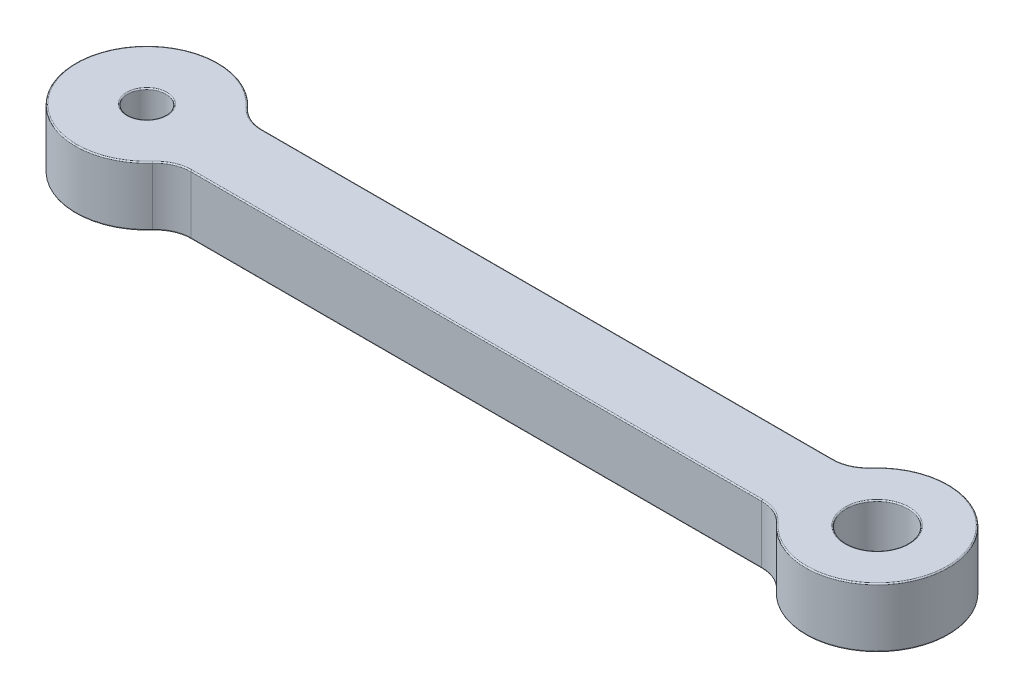
ISO-10303-21;
HEADER;
FILE_DESCRIPTION(('STEP AP214'),'2;1');
FILE_NAME('part.step','',(''),(''),'','','');
FILE_SCHEMA(('AUTOMOTIVE_DESIGN { 1 0 10303 214 1 1 1 1 }'));
ENDSEC;
DATA;
#1=APPLICATION_CONTEXT('core data for automotive mechanical design processes');
#2=APPLICATION_PROTOCOL_DEFINITION('international standard','automotive_design',2000,#1);
#3=PRODUCT_CONTEXT('',#1,'mechanical');
#4=PRODUCT('Part','Part','',(#3));
#5=PRODUCT_RELATED_PRODUCT_CATEGORY('part','',(#4));
#6=PRODUCT_DEFINITION_FORMATION('','',#4);
#7=PRODUCT_DEFINITION_CONTEXT('part definition',#1,'design');
#8=PRODUCT_DEFINITION('design','',#6,#7);
#9=PRODUCT_DEFINITION_SHAPE('','',#8);
#10=(LENGTH_UNIT() NAMED_UNIT(*) SI_UNIT(.MILLI.,.METRE.));
#11=(NAMED_UNIT(*) PLANE_ANGLE_UNIT() SI_UNIT($,.RADIAN.));
#12=(NAMED_UNIT(*) SI_UNIT($,.STERADIAN.) SOLID_ANGLE_UNIT());
#13=UNCERTAINTY_MEASURE_WITH_UNIT(LENGTH_MEASURE(1.E-05),#10,'distance_accuracy_value','');
#14=(GEOMETRIC_REPRESENTATION_CONTEXT(3) GLOBAL_UNCERTAINTY_ASSIGNED_CONTEXT((#13)) GLOBAL_UNIT_ASSIGNED_CONTEXT((#10,
#11,#12)) REPRESENTATION_CONTEXT('',''));
#15=CARTESIAN_POINT('',(0.,0.,0.));
#16=DIRECTION('',(0.,0.,1.));
#17=DIRECTION('',(1.,0.,0.));
#18=AXIS2_PLACEMENT_3D('',#15,#16,#17);
#19=CARTESIAN_POINT('',(0.,5.,-3.));
#20=DIRECTION('',(0.,0.,-1.));
#21=DIRECTION('',(-1.,0.,0.));
#22=AXIS2_PLACEMENT_3D('',#19,#20,#21);
#23=PLANE('',#22);
#24=DIRECTION('',(0.,-1.,0.));
#25=VECTOR('',#24,1.);
#26=CARTESIAN_POINT('',(54.7082039324994,5.,-3.));
#27=LINE('',#26,#25);
#28=CARTESIAN_POINT('',(54.7082039324994,4.9,-3.));
#29=VERTEX_POINT('',#28);
#30=CARTESIAN_POINT('',(54.7082039324994,0.1,-3.));
#31=VERTEX_POINT('',#30);
#32=EDGE_CURVE('E352',#29,#31,#27,.T.);
#33=ORIENTED_EDGE('',*,*,#32,.T.);
#34=DIRECTION('',(1.,0.,0.));
#35=VECTOR('',#34,1.);
#36=CARTESIAN_POINT('',(6.70820393249937,0.1,-3.));
#37=LINE('',#36,#35);
#38=CARTESIAN_POINT('',(6.70820393249937,0.1,-3.));
#39=VERTEX_POINT('',#38);
#40=EDGE_CURVE('E277',#31,#39,#37,.F.);
#41=ORIENTED_EDGE('',*,*,#40,.T.);
#42=DIRECTION('',(0.,-1.,0.));
#43=VECTOR('',#42,1.);
#44=CARTESIAN_POINT('',(6.70820393249937,5.,-3.));
#45=LINE('',#44,#43);
#46=CARTESIAN_POINT('',(6.70820393249937,4.9,-3.));
#47=VERTEX_POINT('',#46);
#48=EDGE_CURVE('E184',#47,#39,#45,.T.);
#49=ORIENTED_EDGE('',*,*,#48,.F.);
#50=DIRECTION('',(1.,0.,0.));
#51=VECTOR('',#50,1.);
#52=CARTESIAN_POINT('',(0.,4.9,-3.));
#53=LINE('',#52,#51);
#54=EDGE_CURVE('E274',#47,#29,#53,.T.);
#55=ORIENTED_EDGE('',*,*,#54,.T.);
#56=EDGE_LOOP('',(#33,#41,#49,#55));
#57=FACE_BOUND('',#56,.T.);
#58=ADVANCED_FACE('F45',(#57),#23,.T.);
#59=CARTESIAN_POINT('',(6.70820393249937,5.,-6.));
#60=DIRECTION('',(0.,-1.,0.));
#61=DIRECTION('',(0.,0.,-1.));
#62=AXIS2_PLACEMENT_3D('',#59,#60,#61);
#63=CYLINDRICAL_SURFACE('',#62,3.);
#64=ORIENTED_EDGE('',*,*,#48,.T.);
#65=CARTESIAN_POINT('',(6.70820393249937,0.1,-6.));
#66=DIRECTION('',(0.,1.,0.));
#67=DIRECTION('',(0.,0.,1.));
#68=AXIS2_PLACEMENT_3D('',#65,#66,#67);
#69=CIRCLE('',#68,3.);
#70=CARTESIAN_POINT('',(4.47213595499958,0.1,-4.));
#71=VERTEX_POINT('',#70);
#72=EDGE_CURVE('E182',#39,#71,#69,.F.);
#73=ORIENTED_EDGE('',*,*,#72,.T.);
#74=DIRECTION('',(0.,-1.,0.));
#75=VECTOR('',#74,1.);
#76=CARTESIAN_POINT('',(4.47213595499958,5.,-4.));
#77=LINE('',#76,#75);
#78=CARTESIAN_POINT('',(4.47213595499958,4.9,-4.));
#79=VERTEX_POINT('',#78);
#80=EDGE_CURVE('E163',#79,#71,#77,.T.);
#81=ORIENTED_EDGE('',*,*,#80,.F.);
#82=CARTESIAN_POINT('',(6.70820393249937,4.9,-6.));
#83=DIRECTION('',(0.,1.,0.));
#84=DIRECTION('',(0.,0.,1.));
#85=AXIS2_PLACEMENT_3D('',#82,#83,#84);
#86=CIRCLE('',#85,3.);
#87=EDGE_CURVE('E179',#79,#47,#86,.T.);
#88=ORIENTED_EDGE('',*,*,#87,.T.);
#89=EDGE_LOOP('',(#64,#73,#81,#88));
#90=FACE_BOUND('',#89,.T.);
#91=ADVANCED_FACE('F177',(#90),#63,.F.);
#92=CARTESIAN_POINT('',(0.,5.,0.));
#93=DIRECTION('',(0.,-1.,0.));
#94=DIRECTION('',(0.,0.,-1.));
#95=AXIS2_PLACEMENT_3D('',#92,#93,#94);
#96=CYLINDRICAL_SURFACE('',#95,6.);
#97=ORIENTED_EDGE('',*,*,#80,.T.);
#98=CARTESIAN_POINT('',(0.,0.1,0.));
#99=DIRECTION('',(0.,1.,0.));
#100=DIRECTION('',(0.,0.,1.));
#101=AXIS2_PLACEMENT_3D('',#98,#99,#100);
#102=CIRCLE('',#101,6.);
#103=CARTESIAN_POINT('',(4.47213595499958,0.1,4.));
#104=VERTEX_POINT('',#103);
#105=EDGE_CURVE('E171',#71,#104,#102,.T.);
#106=ORIENTED_EDGE('',*,*,#105,.T.);
#107=DIRECTION('',(0.,-1.,0.));
#108=VECTOR('',#107,1.);
#109=CARTESIAN_POINT('',(4.47213595499958,5.,4.));
#110=LINE('',#109,#108);
#111=CARTESIAN_POINT('',(4.47213595499958,4.9,4.));
#112=VERTEX_POINT('',#111);
#113=EDGE_CURVE('E165',#112,#104,#110,.T.);
#114=ORIENTED_EDGE('',*,*,#113,.F.);
#115=CARTESIAN_POINT('',(0.,4.9,0.));
#116=DIRECTION('',(0.,1.,0.));
#117=DIRECTION('',(0.,0.,1.));
#118=AXIS2_PLACEMENT_3D('',#115,#116,#117);
#119=CIRCLE('',#118,6.);
#120=EDGE_CURVE('E160',#112,#79,#119,.F.);
#121=ORIENTED_EDGE('',*,*,#120,.T.);
#122=EDGE_LOOP('',(#97,#106,#114,#121));
#123=FACE_BOUND('',#122,.T.);
#124=ADVANCED_FACE('F162',(#123),#96,.T.);
#125=CARTESIAN_POINT('',(6.70820393249937,5.,6.));
#126=DIRECTION('',(0.,-1.,0.));
#127=DIRECTION('',(0.,0.,-1.));
#128=AXIS2_PLACEMENT_3D('',#125,#126,#127);
#129=CYLINDRICAL_SURFACE('',#128,3.);
#130=ORIENTED_EDGE('',*,*,#113,.T.);
#131=CARTESIAN_POINT('',(6.70820393249937,0.1,6.));
#132=DIRECTION('',(0.,1.,0.));
#133=DIRECTION('',(0.,0.,1.));
#134=AXIS2_PLACEMENT_3D('',#131,#132,#133);
#135=CIRCLE('',#134,3.);
#136=CARTESIAN_POINT('',(6.70820393249937,0.1,3.));
#137=VERTEX_POINT('',#136);
#138=EDGE_CURVE('E246',#104,#137,#135,.F.);
#139=ORIENTED_EDGE('',*,*,#138,.T.);
#140=DIRECTION('',(0.,-1.,0.));
#141=VECTOR('',#140,1.);
#142=CARTESIAN_POINT('',(6.70820393249937,5.,3.));
#143=LINE('',#142,#141);
#144=CARTESIAN_POINT('',(6.70820393249937,4.9,3.));
#145=VERTEX_POINT('',#144);
#146=EDGE_CURVE('E409',#145,#137,#143,.T.);
#147=ORIENTED_EDGE('',*,*,#146,.F.);
#148=CARTESIAN_POINT('',(6.70820393249937,4.9,6.));
#149=DIRECTION('',(0.,1.,0.));
#150=DIRECTION('',(0.,0.,1.));
#151=AXIS2_PLACEMENT_3D('',#148,#149,#150);
#152=CIRCLE('',#151,3.);
#153=EDGE_CURVE('E243',#145,#112,#152,.T.);
#154=ORIENTED_EDGE('',*,*,#153,.T.);
#155=EDGE_LOOP('',(#130,#139,#147,#154));
#156=FACE_BOUND('',#155,.T.);
#157=ADVANCED_FACE('F416',(#156),#129,.F.);
#158=CARTESIAN_POINT('',(0.,5.,3.));
#159=DIRECTION('',(0.,0.,-1.));
#160=DIRECTION('',(-1.,0.,0.));
#161=AXIS2_PLACEMENT_3D('',#158,#159,#160);
#162=PLANE('',#161);
#163=ORIENTED_EDGE('',*,*,#146,.T.);
#164=DIRECTION('',(1.,0.,0.));
#165=VECTOR('',#164,1.);
#166=CARTESIAN_POINT('',(0.,0.1,3.));
#167=LINE('',#166,#165);
#168=CARTESIAN_POINT('',(54.7082039324994,0.1,3.));
#169=VERTEX_POINT('',#168);
#170=EDGE_CURVE('E252',#137,#169,#167,.T.);
#171=ORIENTED_EDGE('',*,*,#170,.T.);
#172=DIRECTION('',(0.,-1.,0.));
#173=VECTOR('',#172,1.);
#174=CARTESIAN_POINT('',(54.7082039324994,5.,3.));
#175=LINE('',#174,#173);
#176=CARTESIAN_POINT('',(54.7082039324994,4.9,3.));
#177=VERTEX_POINT('',#176);
#178=EDGE_CURVE('E405',#177,#169,#175,.T.);
#179=ORIENTED_EDGE('',*,*,#178,.F.);
#180=DIRECTION('',(1.,0.,0.));
#181=VECTOR('',#180,1.);
#182=CARTESIAN_POINT('',(6.70820393249937,4.9,3.));
#183=LINE('',#182,#181);
#184=EDGE_CURVE('E249',#177,#145,#183,.F.);
#185=ORIENTED_EDGE('',*,*,#184,.T.);
#186=EDGE_LOOP('',(#163,#171,#179,#185));
#187=FACE_BOUND('',#186,.T.);
#188=ADVANCED_FACE('F459',(#187),#162,.F.);
#189=CARTESIAN_POINT('',(54.7082039324994,5.,6.));
#190=DIRECTION('',(0.,-1.,0.));
#191=DIRECTION('',(0.,0.,-1.));
#192=AXIS2_PLACEMENT_3D('',#189,#190,#191);
#193=CYLINDRICAL_SURFACE('',#192,3.);
#194=ORIENTED_EDGE('',*,*,#178,.T.);
#195=CARTESIAN_POINT('',(54.7082039324994,0.1,6.));
#196=DIRECTION('',(0.,1.,0.));
#197=DIRECTION('',(0.,0.,1.));
#198=AXIS2_PLACEMENT_3D('',#195,#196,#197);
#199=CIRCLE('',#198,3.);
#200=CARTESIAN_POINT('',(56.9442719099992,0.1,4.));
#201=VERTEX_POINT('',#200);
#202=EDGE_CURVE('E258',#169,#201,#199,.F.);
#203=ORIENTED_EDGE('',*,*,#202,.T.);
#204=DIRECTION('',(0.,-1.,0.));
#205=VECTOR('',#204,1.);
#206=CARTESIAN_POINT('',(56.9442719099992,5.,4.));
#207=LINE('',#206,#205);
#208=CARTESIAN_POINT('',(56.9442719099992,4.9,4.));
#209=VERTEX_POINT('',#208);
#210=EDGE_CURVE('E399',#209,#201,#207,.T.);
#211=ORIENTED_EDGE('',*,*,#210,.F.);
#212=CARTESIAN_POINT('',(54.7082039324994,4.9,6.));
#213=DIRECTION('',(0.,1.,0.));
#214=DIRECTION('',(0.,0.,1.));
#215=AXIS2_PLACEMENT_3D('',#212,#213,#214);
#216=CIRCLE('',#215,3.);
#217=EDGE_CURVE('E255',#209,#177,#216,.T.);
#218=ORIENTED_EDGE('',*,*,#217,.T.);
#219=EDGE_LOOP('',(#194,#203,#211,#218));
#220=FACE_BOUND('',#219,.T.);
#221=ADVANCED_FACE('F461',(#220),#193,.F.);
#222=CARTESIAN_POINT('',(61.4164078649987,5.,0.));
#223=DIRECTION('',(0.,-1.,0.));
#224=DIRECTION('',(0.,0.,-1.));
#225=AXIS2_PLACEMENT_3D('',#222,#223,#224);
#226=CYLINDRICAL_SURFACE('',#225,6.);
#227=ORIENTED_EDGE('',*,*,#210,.T.);
#228=CARTESIAN_POINT('',(61.4164078649987,0.1,0.));
#229=DIRECTION('',(0.,1.,0.));
#230=DIRECTION('',(0.,0.,1.));
#231=AXIS2_PLACEMENT_3D('',#228,#229,#230);
#232=CIRCLE('',#231,6.);
#233=CARTESIAN_POINT('',(56.9442719099992,0.1,-4.));
#234=VERTEX_POINT('',#233);
#235=EDGE_CURVE('E264',#201,#234,#232,.T.);
#236=ORIENTED_EDGE('',*,*,#235,.T.);
#237=DIRECTION('',(0.,-1.,0.));
#238=VECTOR('',#237,1.);
#239=CARTESIAN_POINT('',(56.9442719099992,5.,-4.));
#240=LINE('',#239,#238);
#241=CARTESIAN_POINT('',(56.9442719099992,4.9,-4.));
#242=VERTEX_POINT('',#241);
#243=EDGE_CURVE('E396',#242,#234,#240,.T.);
#244=ORIENTED_EDGE('',*,*,#243,.F.);
#245=CARTESIAN_POINT('',(61.4164078649987,4.9,0.));
#246=DIRECTION('',(0.,1.,0.));
#247=DIRECTION('',(0.,0.,1.));
#248=AXIS2_PLACEMENT_3D('',#245,#246,#247);
#249=CIRCLE('',#248,6.);
#250=EDGE_CURVE('E261',#242,#209,#249,.F.);
#251=ORIENTED_EDGE('',*,*,#250,.T.);
#252=EDGE_LOOP('',(#227,#236,#244,#251));
#253=FACE_BOUND('',#252,.T.);
#254=ADVANCED_FACE('F494',(#253),#226,.T.);
#255=CARTESIAN_POINT('',(61.4164078649987,5.,0.));
#256=DIRECTION('',(0.,-1.,0.));
#257=DIRECTION('',(0.,0.,-1.));
#258=AXIS2_PLACEMENT_3D('',#255,#256,#257);
#259=CYLINDRICAL_SURFACE('',#258,2.6);
#260=CARTESIAN_POINT('',(61.4164078649987,0.1,0.));
#261=DIRECTION('',(0.,1.,0.));
#262=DIRECTION('',(0.,0.,1.));
#263=AXIS2_PLACEMENT_3D('',#260,#261,#262);
#264=CIRCLE('',#263,2.6);
#265=CARTESIAN_POINT('',(61.4164078649987,0.1,2.6));
#266=VERTEX_POINT('',#265);
#267=EDGE_CURVE('E284',#266,#266,#264,.F.);
#268=ORIENTED_EDGE('',*,*,#267,.T.);
#269=EDGE_LOOP('',(#268));
#270=FACE_BOUND('',#269,.T.);
#271=CARTESIAN_POINT('',(61.4164078649987,4.9,0.));
#272=DIRECTION('',(0.,1.,0.));
#273=DIRECTION('',(0.,0.,1.));
#274=AXIS2_PLACEMENT_3D('',#271,#272,#273);
#275=CIRCLE('',#274,2.6);
#276=CARTESIAN_POINT('',(61.4164078649987,4.9,2.6));
#277=VERTEX_POINT('',#276);
#278=EDGE_CURVE('E280',#277,#277,#275,.T.);
#279=ORIENTED_EDGE('',*,*,#278,.T.);
#280=EDGE_LOOP('',(#279));
#281=FACE_BOUND('',#280,.T.);
#282=ADVANCED_FACE('F490',(#270,#281),#259,.F.);
#283=CARTESIAN_POINT('',(0.,5.,0.));
#284=DIRECTION('',(0.,-1.,0.));
#285=DIRECTION('',(0.,0.,-1.));
#286=AXIS2_PLACEMENT_3D('',#283,#284,#285);
#287=CYLINDRICAL_SURFACE('',#286,1.6);
#288=CARTESIAN_POINT('',(0.,0.1,0.));
#289=DIRECTION('',(0.,1.,0.));
#290=DIRECTION('',(0.,0.,1.));
#291=AXIS2_PLACEMENT_3D('',#288,#289,#290);
#292=CIRCLE('',#291,1.6);
#293=CARTESIAN_POINT('',(0.,0.1,1.6));
#294=VERTEX_POINT('',#293);
#295=EDGE_CURVE('E292',#294,#294,#292,.F.);
#296=ORIENTED_EDGE('',*,*,#295,.T.);
#297=EDGE_LOOP('',(#296));
#298=FACE_BOUND('',#297,.T.);
#299=CARTESIAN_POINT('',(0.,4.9,0.));
#300=DIRECTION('',(0.,1.,0.));
#301=DIRECTION('',(0.,0.,1.));
#302=AXIS2_PLACEMENT_3D('',#299,#300,#301);
#303=CIRCLE('',#302,1.6);
#304=CARTESIAN_POINT('',(0.,4.9,1.6));
#305=VERTEX_POINT('',#304);
#306=EDGE_CURVE('E288',#305,#305,#303,.T.);
#307=ORIENTED_EDGE('',*,*,#306,.T.);
#308=EDGE_LOOP('',(#307));
#309=FACE_BOUND('',#308,.T.);
#310=ADVANCED_FACE('F493',(#298,#309),#287,.F.);
#311=CARTESIAN_POINT('',(54.7082039324994,5.,-6.));
#312=DIRECTION('',(0.,-1.,0.));
#313=DIRECTION('',(0.,0.,-1.));
#314=AXIS2_PLACEMENT_3D('',#311,#312,#313);
#315=CYLINDRICAL_SURFACE('',#314,3.);
#316=ORIENTED_EDGE('',*,*,#243,.T.);
#317=CARTESIAN_POINT('',(54.7082039324994,0.1,-6.));
#318=DIRECTION('',(0.,1.,0.));
#319=DIRECTION('',(0.,0.,1.));
#320=AXIS2_PLACEMENT_3D('',#317,#318,#319);
#321=CIRCLE('',#320,3.);
#322=EDGE_CURVE('E271',#234,#31,#321,.F.);
#323=ORIENTED_EDGE('',*,*,#322,.T.);
#324=ORIENTED_EDGE('',*,*,#32,.F.);
#325=CARTESIAN_POINT('',(54.7082039324994,4.9,-6.));
#326=DIRECTION('',(0.,1.,0.));
#327=DIRECTION('',(0.,0.,1.));
#328=AXIS2_PLACEMENT_3D('',#325,#326,#327);
#329=CIRCLE('',#328,3.);
#330=EDGE_CURVE('E267',#29,#242,#329,.T.);
#331=ORIENTED_EDGE('',*,*,#330,.T.);
#332=EDGE_LOOP('',(#316,#323,#324,#331));
#333=FACE_BOUND('',#332,.T.);
#334=ADVANCED_FACE('F392',(#333),#315,.F.);
#335=CARTESIAN_POINT('',(0.,5.,0.));
#336=DIRECTION('',(0.,1.,0.));
#337=DIRECTION('',(0.,0.,1.));
#338=AXIS2_PLACEMENT_3D('',#335,#336,#337);
#339=PLANE('',#338);
#340=CARTESIAN_POINT('',(61.4164078649987,5.,0.));
#341=DIRECTION('',(0.,1.,0.));
#342=DIRECTION('',(0.,0.,1.));
#343=AXIS2_PLACEMENT_3D('',#340,#341,#342);
#344=CIRCLE('',#343,5.9);
#345=CARTESIAN_POINT('',(57.0188075092492,5.,3.93333333333333));
#346=VERTEX_POINT('',#345);
#347=CARTESIAN_POINT('',(57.0188075092492,5.,-3.93333333333333));
#348=VERTEX_POINT('',#347);
#349=EDGE_CURVE('E55',#346,#348,#344,.T.);
#350=ORIENTED_EDGE('',*,*,#349,.T.);
#351=CARTESIAN_POINT('',(54.7082039324994,5.,-6.));
#352=DIRECTION('',(0.,1.,0.));
#353=DIRECTION('',(0.,0.,1.));
#354=AXIS2_PLACEMENT_3D('',#351,#352,#353);
#355=CIRCLE('',#354,3.1);
#356=CARTESIAN_POINT('',(54.7082039324994,5.,-2.9));
#357=VERTEX_POINT('',#356);
#358=EDGE_CURVE('E11',#348,#357,#355,.F.);
#359=ORIENTED_EDGE('',*,*,#358,.T.);
#360=DIRECTION('',(1.,0.,0.));
#361=VECTOR('',#360,1.);
#362=CARTESIAN_POINT('',(0.,5.,-2.9));
#363=LINE('',#362,#361);
#364=CARTESIAN_POINT('',(6.70820393249937,5.,-2.9));
#365=VERTEX_POINT('',#364);
#366=EDGE_CURVE('E304',#357,#365,#363,.F.);
#367=ORIENTED_EDGE('',*,*,#366,.T.);
#368=CARTESIAN_POINT('',(6.70820393249937,5.,-6.));
#369=DIRECTION('',(0.,1.,0.));
#370=DIRECTION('',(0.,0.,1.));
#371=AXIS2_PLACEMENT_3D('',#368,#369,#370);
#372=CIRCLE('',#371,3.1);
#373=CARTESIAN_POINT('',(4.39760035574959,5.,-3.93333333333333));
#374=VERTEX_POINT('',#373);
#375=EDGE_CURVE('E307',#365,#374,#372,.F.);
#376=ORIENTED_EDGE('',*,*,#375,.T.);
#377=CARTESIAN_POINT('',(0.,5.,0.));
#378=DIRECTION('',(0.,1.,0.));
#379=DIRECTION('',(0.,0.,1.));
#380=AXIS2_PLACEMENT_3D('',#377,#378,#379);
#381=CIRCLE('',#380,5.9);
#382=CARTESIAN_POINT('',(4.39760035574958,5.,3.93333333333333));
#383=VERTEX_POINT('',#382);
#384=EDGE_CURVE('E190',#374,#383,#381,.T.);
#385=ORIENTED_EDGE('',*,*,#384,.T.);
#386=CARTESIAN_POINT('',(6.70820393249937,5.,6.));
#387=DIRECTION('',(0.,1.,0.));
#388=DIRECTION('',(0.,0.,1.));
#389=AXIS2_PLACEMENT_3D('',#386,#387,#388);
#390=CIRCLE('',#389,3.1);
#391=CARTESIAN_POINT('',(6.70820393249937,5.,2.9));
#392=VERTEX_POINT('',#391);
#393=EDGE_CURVE('E312',#383,#392,#390,.F.);
#394=ORIENTED_EDGE('',*,*,#393,.T.);
#395=DIRECTION('',(1.,0.,0.));
#396=VECTOR('',#395,1.);
#397=CARTESIAN_POINT('',(54.7082039324994,5.,2.9));
#398=LINE('',#397,#396);
#399=CARTESIAN_POINT('',(54.7082039324994,5.,2.9));
#400=VERTEX_POINT('',#399);
#401=EDGE_CURVE('E315',#392,#400,#398,.T.);
#402=ORIENTED_EDGE('',*,*,#401,.T.);
#403=CARTESIAN_POINT('',(54.7082039324994,5.,6.));
#404=DIRECTION('',(0.,1.,0.));
#405=DIRECTION('',(0.,0.,1.));
#406=AXIS2_PLACEMENT_3D('',#403,#404,#405);
#407=CIRCLE('',#406,3.1);
#408=EDGE_CURVE('E66',#400,#346,#407,.F.);
#409=ORIENTED_EDGE('',*,*,#408,.T.);
#410=EDGE_LOOP('',(#350,#359,#367,#376,#385,#394,#402,#409));
#411=FACE_BOUND('',#410,.T.);
#412=CARTESIAN_POINT('',(61.4164078649987,5.,0.));
#413=DIRECTION('',(0.,1.,0.));
#414=DIRECTION('',(0.,0.,1.));
#415=AXIS2_PLACEMENT_3D('',#412,#413,#414);
#416=CIRCLE('',#415,2.7);
#417=CARTESIAN_POINT('',(61.4164078649987,5.,2.7));
#418=VERTEX_POINT('',#417);
#419=EDGE_CURVE('E300',#418,#418,#416,.F.);
#420=ORIENTED_EDGE('',*,*,#419,.T.);
#421=EDGE_LOOP('',(#420));
#422=FACE_BOUND('',#421,.T.);
#423=CARTESIAN_POINT('',(0.,5.,0.));
#424=DIRECTION('',(0.,1.,0.));
#425=DIRECTION('',(0.,0.,1.));
#426=AXIS2_PLACEMENT_3D('',#423,#424,#425);
#427=CIRCLE('',#426,1.7);
#428=CARTESIAN_POINT('',(0.,5.,1.7));
#429=VERTEX_POINT('',#428);
#430=EDGE_CURVE('E296',#429,#429,#427,.F.);
#431=ORIENTED_EDGE('',*,*,#430,.T.);
#432=EDGE_LOOP('',(#431));
#433=FACE_BOUND('',#432,.T.);
#434=ADVANCED_FACE('F378',(#411,#422,#433),#339,.T.);
#435=CARTESIAN_POINT('',(0.,0.,0.));
#436=DIRECTION('',(0.,1.,0.));
#437=DIRECTION('',(0.,0.,1.));
#438=AXIS2_PLACEMENT_3D('',#435,#436,#437);
#439=PLANE('',#438);
#440=CARTESIAN_POINT('',(0.,0.,0.));
#441=DIRECTION('',(0.,1.,0.));
#442=DIRECTION('',(0.,0.,1.));
#443=AXIS2_PLACEMENT_3D('',#440,#441,#442);
#444=CIRCLE('',#443,5.9);
#445=CARTESIAN_POINT('',(4.39760035574959,0.,3.93333333333333));
#446=VERTEX_POINT('',#445);
#447=CARTESIAN_POINT('',(4.39760035574959,0.,-3.93333333333333));
#448=VERTEX_POINT('',#447);
#449=EDGE_CURVE('E235',#446,#448,#444,.F.);
#450=ORIENTED_EDGE('',*,*,#449,.T.);
#451=CARTESIAN_POINT('',(6.70820393249937,0.,-6.));
#452=DIRECTION('',(0.,1.,0.));
#453=DIRECTION('',(0.,0.,1.));
#454=AXIS2_PLACEMENT_3D('',#451,#452,#453);
#455=CIRCLE('',#454,3.1);
#456=CARTESIAN_POINT('',(6.70820393249937,0.,-2.9));
#457=VERTEX_POINT('',#456);
#458=EDGE_CURVE('E172',#448,#457,#455,.T.);
#459=ORIENTED_EDGE('',*,*,#458,.T.);
#460=DIRECTION('',(1.,0.,0.));
#461=VECTOR('',#460,1.);
#462=CARTESIAN_POINT('',(54.7082039324994,0.,-2.9));
#463=LINE('',#462,#461);
#464=CARTESIAN_POINT('',(54.7082039324994,0.,-2.9));
#465=VERTEX_POINT('',#464);
#466=EDGE_CURVE('E217',#457,#465,#463,.T.);
#467=ORIENTED_EDGE('',*,*,#466,.T.);
#468=CARTESIAN_POINT('',(54.7082039324994,0.,-6.));
#469=DIRECTION('',(0.,1.,0.));
#470=DIRECTION('',(0.,0.,1.));
#471=AXIS2_PLACEMENT_3D('',#468,#469,#470);
#472=CIRCLE('',#471,3.1);
#473=CARTESIAN_POINT('',(57.0188075092492,0.,-3.93333333333333));
#474=VERTEX_POINT('',#473);
#475=EDGE_CURVE('E220',#465,#474,#472,.T.);
#476=ORIENTED_EDGE('',*,*,#475,.T.);
#477=CARTESIAN_POINT('',(61.4164078649987,0.,0.));
#478=DIRECTION('',(0.,1.,0.));
#479=DIRECTION('',(0.,0.,1.));
#480=AXIS2_PLACEMENT_3D('',#477,#478,#479);
#481=CIRCLE('',#480,5.9);
#482=CARTESIAN_POINT('',(57.0188075092492,0.,3.93333333333333));
#483=VERTEX_POINT('',#482);
#484=EDGE_CURVE('E223',#474,#483,#481,.F.);
#485=ORIENTED_EDGE('',*,*,#484,.T.);
#486=CARTESIAN_POINT('',(54.7082039324994,0.,6.));
#487=DIRECTION('',(0.,1.,0.));
#488=DIRECTION('',(0.,0.,1.));
#489=AXIS2_PLACEMENT_3D('',#486,#487,#488);
#490=CIRCLE('',#489,3.1);
#491=CARTESIAN_POINT('',(54.7082039324994,0.,2.9));
#492=VERTEX_POINT('',#491);
#493=EDGE_CURVE('E226',#483,#492,#490,.T.);
#494=ORIENTED_EDGE('',*,*,#493,.T.);
#495=DIRECTION('',(1.,0.,0.));
#496=VECTOR('',#495,1.);
#497=CARTESIAN_POINT('',(0.,0.,2.9));
#498=LINE('',#497,#496);
#499=CARTESIAN_POINT('',(6.70820393249937,0.,2.9));
#500=VERTEX_POINT('',#499);
#501=EDGE_CURVE('E229',#492,#500,#498,.F.);
#502=ORIENTED_EDGE('',*,*,#501,.T.);
#503=CARTESIAN_POINT('',(6.70820393249937,0.,6.));
#504=DIRECTION('',(0.,1.,0.));
#505=DIRECTION('',(0.,0.,1.));
#506=AXIS2_PLACEMENT_3D('',#503,#504,#505);
#507=CIRCLE('',#506,3.1);
#508=EDGE_CURVE('E232',#500,#446,#507,.T.);
#509=ORIENTED_EDGE('',*,*,#508,.T.);
#510=EDGE_LOOP('',(#450,#459,#467,#476,#485,#494,#502,#509));
#511=FACE_BOUND('',#510,.T.);
#512=CARTESIAN_POINT('',(61.4164078649987,0.,0.));
#513=DIRECTION('',(0.,1.,0.));
#514=DIRECTION('',(0.,0.,1.));
#515=AXIS2_PLACEMENT_3D('',#512,#513,#514);
#516=CIRCLE('',#515,2.7);
#517=CARTESIAN_POINT('',(61.4164078649987,0.,2.7));
#518=VERTEX_POINT('',#517);
#519=EDGE_CURVE('E213',#518,#518,#516,.T.);
#520=ORIENTED_EDGE('',*,*,#519,.T.);
#521=EDGE_LOOP('',(#520));
#522=FACE_BOUND('',#521,.T.);
#523=CARTESIAN_POINT('',(0.,0.,0.));
#524=DIRECTION('',(0.,1.,0.));
#525=DIRECTION('',(0.,0.,1.));
#526=AXIS2_PLACEMENT_3D('',#523,#524,#525);
#527=CIRCLE('',#526,1.7);
#528=CARTESIAN_POINT('',(0.,0.,1.7));
#529=VERTEX_POINT('',#528);
#530=EDGE_CURVE('E206',#529,#529,#527,.T.);
#531=ORIENTED_EDGE('',*,*,#530,.T.);
#532=EDGE_LOOP('',(#531));
#533=FACE_BOUND('',#532,.T.);
#534=ADVANCED_FACE('F430',(#511,#522,#533),#439,.F.);
#535=CARTESIAN_POINT('',(54.7082039324994,0.1,6.));
#536=DIRECTION('',(0.,1.,0.));
#537=DIRECTION('',(0.,0.,1.));
#538=AXIS2_PLACEMENT_3D('',#535,#536,#537);
#539=TOROIDAL_SURFACE('',#538,3.1,0.1);
#540=CARTESIAN_POINT('',(54.7082039324994,0.1,2.9));
#541=DIRECTION('',(-1.,0.,0.));
#542=DIRECTION('',(0.,0.,1.));
#543=AXIS2_PLACEMENT_3D('',#540,#541,#542);
#544=CIRCLE('',#543,0.1);
#545=EDGE_CURVE('E344',#492,#169,#544,.T.);
#546=ORIENTED_EDGE('',*,*,#545,.F.);
#547=ORIENTED_EDGE('',*,*,#493,.F.);
#548=CARTESIAN_POINT('',(57.0188075092492,0.1,3.93333333333333));
#549=DIRECTION('',(0.666666666666677,0.,0.745355992499921));
#550=DIRECTION('',(0.745355992499921,0.,-0.666666666666677));
#551=AXIS2_PLACEMENT_3D('',#548,#549,#550);
#552=CIRCLE('',#551,0.1);
#553=EDGE_CURVE('E348',#201,#483,#552,.T.);
#554=ORIENTED_EDGE('',*,*,#553,.F.);
#555=ORIENTED_EDGE('',*,*,#202,.F.);
#556=EDGE_LOOP('',(#546,#547,#554,#555));
#557=FACE_BOUND('',#556,.T.);
#558=ADVANCED_FACE('F451',(#557),#539,.T.);
#559=CARTESIAN_POINT('',(61.4164078649987,0.1,0.));
#560=DIRECTION('',(0.,1.,0.));
#561=DIRECTION('',(0.,0.,1.));
#562=AXIS2_PLACEMENT_3D('',#559,#560,#561);
#563=TOROIDAL_SURFACE('',#562,5.9,0.1);
#564=ORIENTED_EDGE('',*,*,#553,.T.);
#565=ORIENTED_EDGE('',*,*,#484,.F.);
#566=CARTESIAN_POINT('',(57.0188075092492,0.1,-3.93333333333333));
#567=DIRECTION('',(-0.666666666666677,0.,0.745355992499921));
#568=DIRECTION('',(0.745355992499921,0.,0.666666666666677));
#569=AXIS2_PLACEMENT_3D('',#566,#567,#568);
#570=CIRCLE('',#569,0.1);
#571=EDGE_CURVE('E340',#234,#474,#570,.T.);
#572=ORIENTED_EDGE('',*,*,#571,.F.);
#573=ORIENTED_EDGE('',*,*,#235,.F.);
#574=EDGE_LOOP('',(#564,#565,#572,#573));
#575=FACE_BOUND('',#574,.T.);
#576=ADVANCED_FACE('F446',(#575),#563,.T.);
#577=CARTESIAN_POINT('',(0.,0.1,2.9));
#578=DIRECTION('',(1.,0.,0.));
#579=DIRECTION('',(0.,0.,-1.));
#580=AXIS2_PLACEMENT_3D('',#577,#578,#579);
#581=CYLINDRICAL_SURFACE('',#580,0.1);
#582=ORIENTED_EDGE('',*,*,#545,.T.);
#583=ORIENTED_EDGE('',*,*,#170,.F.);
#584=CARTESIAN_POINT('',(6.70820393249937,0.1,2.9));
#585=DIRECTION('',(-1.,0.,0.));
#586=DIRECTION('',(0.,0.,1.));
#587=AXIS2_PLACEMENT_3D('',#584,#585,#586);
#588=CIRCLE('',#587,0.1);
#589=EDGE_CURVE('E336',#500,#137,#588,.T.);
#590=ORIENTED_EDGE('',*,*,#589,.F.);
#591=ORIENTED_EDGE('',*,*,#501,.F.);
#592=EDGE_LOOP('',(#582,#583,#590,#591));
#593=FACE_BOUND('',#592,.T.);
#594=ADVANCED_FACE('F456',(#593),#581,.T.);
#595=CARTESIAN_POINT('',(54.7082039324994,0.1,-6.));
#596=DIRECTION('',(0.,1.,0.));
#597=DIRECTION('',(0.,0.,1.));
#598=AXIS2_PLACEMENT_3D('',#595,#596,#597);
#599=TOROIDAL_SURFACE('',#598,3.1,0.1);
#600=ORIENTED_EDGE('',*,*,#571,.T.);
#601=ORIENTED_EDGE('',*,*,#475,.F.);
#602=CARTESIAN_POINT('',(54.7082039324994,0.1,-2.9));
#603=DIRECTION('',(-1.,0.,0.));
#604=DIRECTION('',(0.,0.,1.));
#605=AXIS2_PLACEMENT_3D('',#602,#603,#604);
#606=CIRCLE('',#605,0.1);
#607=EDGE_CURVE('E332',#31,#465,#606,.T.);
#608=ORIENTED_EDGE('',*,*,#607,.F.);
#609=ORIENTED_EDGE('',*,*,#322,.F.);
#610=EDGE_LOOP('',(#600,#601,#608,#609));
#611=FACE_BOUND('',#610,.T.);
#612=ADVANCED_FACE('F442',(#611),#599,.T.);
#613=CARTESIAN_POINT('',(6.70820393249937,0.1,6.));
#614=DIRECTION('',(0.,1.,0.));
#615=DIRECTION('',(0.,0.,1.));
#616=AXIS2_PLACEMENT_3D('',#613,#614,#615);
#617=TOROIDAL_SURFACE('',#616,3.1,0.1);
#618=ORIENTED_EDGE('',*,*,#589,.T.);
#619=ORIENTED_EDGE('',*,*,#138,.F.);
#620=CARTESIAN_POINT('',(4.39760035574959,0.1,3.93333333333333));
#621=DIRECTION('',(-0.666666666666669,0.,0.745355992499928));
#622=DIRECTION('',(0.745355992499928,0.,0.666666666666669));
#623=AXIS2_PLACEMENT_3D('',#620,#621,#622);
#624=CIRCLE('',#623,0.1);
#625=EDGE_CURVE('E328',#446,#104,#624,.T.);
#626=ORIENTED_EDGE('',*,*,#625,.F.);
#627=ORIENTED_EDGE('',*,*,#508,.F.);
#628=EDGE_LOOP('',(#618,#619,#626,#627));
#629=FACE_BOUND('',#628,.T.);
#630=ADVANCED_FACE('F420',(#629),#617,.T.);
#631=CARTESIAN_POINT('',(0.,0.1,-2.9));
#632=DIRECTION('',(-1.,0.,0.));
#633=DIRECTION('',(0.,0.,1.));
#634=AXIS2_PLACEMENT_3D('',#631,#632,#633);
#635=CYLINDRICAL_SURFACE('',#634,0.1);
#636=ORIENTED_EDGE('',*,*,#607,.T.);
#637=ORIENTED_EDGE('',*,*,#466,.F.);
#638=CARTESIAN_POINT('',(6.70820393249937,0.1,-2.9));
#639=DIRECTION('',(-1.,0.,0.));
#640=DIRECTION('',(0.,0.,1.));
#641=AXIS2_PLACEMENT_3D('',#638,#639,#640);
#642=CIRCLE('',#641,0.1);
#643=EDGE_CURVE('E325',#39,#457,#642,.T.);
#644=ORIENTED_EDGE('',*,*,#643,.F.);
#645=ORIENTED_EDGE('',*,*,#40,.F.);
#646=EDGE_LOOP('',(#636,#637,#644,#645));
#647=FACE_BOUND('',#646,.T.);
#648=ADVANCED_FACE('F438',(#647),#635,.T.);
#649=CARTESIAN_POINT('',(0.,0.1,0.));
#650=DIRECTION('',(0.,1.,0.));
#651=DIRECTION('',(0.,0.,1.));
#652=AXIS2_PLACEMENT_3D('',#649,#650,#651);
#653=TOROIDAL_SURFACE('',#652,5.9,0.1);
#654=ORIENTED_EDGE('',*,*,#625,.T.);
#655=ORIENTED_EDGE('',*,*,#105,.F.);
#656=CARTESIAN_POINT('',(4.39760035574959,0.1,-3.93333333333333));
#657=DIRECTION('',(0.666666666666664,0.,0.745355992499932));
#658=DIRECTION('',(0.745355992499932,0.,-0.666666666666664));
#659=AXIS2_PLACEMENT_3D('',#656,#657,#658);
#660=CIRCLE('',#659,0.1);
#661=EDGE_CURVE('E322',#448,#71,#660,.T.);
#662=ORIENTED_EDGE('',*,*,#661,.F.);
#663=ORIENTED_EDGE('',*,*,#449,.F.);
#664=EDGE_LOOP('',(#654,#655,#662,#663));
#665=FACE_BOUND('',#664,.T.);
#666=ADVANCED_FACE('F426',(#665),#653,.T.);
#667=CARTESIAN_POINT('',(6.70820393249937,0.1,-6.));
#668=DIRECTION('',(0.,1.,0.));
#669=DIRECTION('',(0.,0.,1.));
#670=AXIS2_PLACEMENT_3D('',#667,#668,#669);
#671=TOROIDAL_SURFACE('',#670,3.1,0.1);
#672=ORIENTED_EDGE('',*,*,#643,.T.);
#673=ORIENTED_EDGE('',*,*,#458,.F.);
#674=ORIENTED_EDGE('',*,*,#661,.T.);
#675=ORIENTED_EDGE('',*,*,#72,.F.);
#676=EDGE_LOOP('',(#672,#673,#674,#675));
#677=FACE_BOUND('',#676,.T.);
#678=ADVANCED_FACE('F433',(#677),#671,.T.);
#679=CARTESIAN_POINT('',(61.4164078649987,0.1,0.));
#680=DIRECTION('',(0.,1.,0.));
#681=DIRECTION('',(0.,0.,1.));
#682=AXIS2_PLACEMENT_3D('',#679,#680,#681);
#683=TOROIDAL_SURFACE('',#682,2.7,0.1);
#684=ORIENTED_EDGE('',*,*,#267,.F.);
#685=EDGE_LOOP('',(#684));
#686=FACE_BOUND('',#685,.T.);
#687=ORIENTED_EDGE('',*,*,#519,.F.);
#688=EDGE_LOOP('',(#687));
#689=FACE_BOUND('',#688,.T.);
#690=ADVANCED_FACE('F501',(#686,#689),#683,.T.);
#691=CARTESIAN_POINT('',(0.,0.1,0.));
#692=DIRECTION('',(0.,1.,0.));
#693=DIRECTION('',(0.,0.,1.));
#694=AXIS2_PLACEMENT_3D('',#691,#692,#693);
#695=TOROIDAL_SURFACE('',#694,1.7,0.1);
#696=ORIENTED_EDGE('',*,*,#295,.F.);
#697=EDGE_LOOP('',(#696));
#698=FACE_BOUND('',#697,.T.);
#699=ORIENTED_EDGE('',*,*,#530,.F.);
#700=EDGE_LOOP('',(#699));
#701=FACE_BOUND('',#700,.T.);
#702=ADVANCED_FACE('F517',(#698,#701),#695,.T.);
#703=CARTESIAN_POINT('',(6.70820393249937,4.9,6.));
#704=DIRECTION('',(0.,1.,0.));
#705=DIRECTION('',(0.,0.,1.));
#706=AXIS2_PLACEMENT_3D('',#703,#704,#705);
#707=TOROIDAL_SURFACE('',#706,3.1,0.1);
#708=CARTESIAN_POINT('',(6.70820393249937,4.9,2.9));
#709=DIRECTION('',(1.,0.,0.));
#710=DIRECTION('',(0.,0.,-1.));
#711=AXIS2_PLACEMENT_3D('',#708,#709,#710);
#712=CIRCLE('',#711,0.1);
#713=EDGE_CURVE('E194',#392,#145,#712,.T.);
#714=ORIENTED_EDGE('',*,*,#713,.F.);
#715=ORIENTED_EDGE('',*,*,#393,.F.);
#716=CARTESIAN_POINT('',(4.39760035574959,4.9,3.93333333333334));
#717=DIRECTION('',(-0.666666666666664,0.,0.745355992499932));
#718=DIRECTION('',(0.745355992499932,0.,0.666666666666664));
#719=AXIS2_PLACEMENT_3D('',#716,#717,#718);
#720=CIRCLE('',#719,0.1);
#721=EDGE_CURVE('E49',#112,#383,#720,.T.);
#722=ORIENTED_EDGE('',*,*,#721,.F.);
#723=ORIENTED_EDGE('',*,*,#153,.F.);
#724=EDGE_LOOP('',(#714,#715,#722,#723));
#725=FACE_BOUND('',#724,.T.);
#726=ADVANCED_FACE('F377',(#725),#707,.T.);
#727=CARTESIAN_POINT('',(0.,4.9,0.));
#728=DIRECTION('',(0.,1.,0.));
#729=DIRECTION('',(0.,0.,1.));
#730=AXIS2_PLACEMENT_3D('',#727,#728,#729);
#731=TOROIDAL_SURFACE('',#730,5.9,0.1);
#732=ORIENTED_EDGE('',*,*,#721,.T.);
#733=ORIENTED_EDGE('',*,*,#384,.F.);
#734=CARTESIAN_POINT('',(4.39760035574959,4.9,-3.93333333333333));
#735=DIRECTION('',(0.666666666666664,0.,0.745355992499932));
#736=DIRECTION('',(0.745355992499932,0.,-0.666666666666664));
#737=AXIS2_PLACEMENT_3D('',#734,#735,#736);
#738=CIRCLE('',#737,0.1);
#739=EDGE_CURVE('E188',#79,#374,#738,.T.);
#740=ORIENTED_EDGE('',*,*,#739,.F.);
#741=ORIENTED_EDGE('',*,*,#120,.F.);
#742=EDGE_LOOP('',(#732,#733,#740,#741));
#743=FACE_BOUND('',#742,.T.);
#744=ADVANCED_FACE('F189',(#743),#731,.T.);
#745=CARTESIAN_POINT('',(0.,4.9,2.9));
#746=DIRECTION('',(-1.,0.,0.));
#747=DIRECTION('',(0.,0.,1.));
#748=AXIS2_PLACEMENT_3D('',#745,#746,#747);
#749=CYLINDRICAL_SURFACE('',#748,0.1);
#750=ORIENTED_EDGE('',*,*,#713,.T.);
#751=ORIENTED_EDGE('',*,*,#184,.F.);
#752=CARTESIAN_POINT('',(54.7082039324994,4.9,2.9));
#753=DIRECTION('',(1.,0.,0.));
#754=DIRECTION('',(0.,0.,-1.));
#755=AXIS2_PLACEMENT_3D('',#752,#753,#754);
#756=CIRCLE('',#755,0.1);
#757=EDGE_CURVE('E195',#400,#177,#756,.T.);
#758=ORIENTED_EDGE('',*,*,#757,.F.);
#759=ORIENTED_EDGE('',*,*,#401,.F.);
#760=EDGE_LOOP('',(#750,#751,#758,#759));
#761=FACE_BOUND('',#760,.T.);
#762=ADVANCED_FACE('F673',(#761),#749,.T.);
#763=CARTESIAN_POINT('',(6.70820393249937,4.9,-6.));
#764=DIRECTION('',(0.,1.,0.));
#765=DIRECTION('',(0.,0.,1.));
#766=AXIS2_PLACEMENT_3D('',#763,#764,#765);
#767=TOROIDAL_SURFACE('',#766,3.1,0.1);
#768=ORIENTED_EDGE('',*,*,#739,.T.);
#769=ORIENTED_EDGE('',*,*,#375,.F.);
#770=CARTESIAN_POINT('',(6.70820393249937,4.9,-2.9));
#771=DIRECTION('',(1.,0.,0.));
#772=DIRECTION('',(0.,0.,-1.));
#773=AXIS2_PLACEMENT_3D('',#770,#771,#772);
#774=CIRCLE('',#773,0.1);
#775=EDGE_CURVE('E200',#47,#365,#774,.T.);
#776=ORIENTED_EDGE('',*,*,#775,.F.);
#777=ORIENTED_EDGE('',*,*,#87,.F.);
#778=EDGE_LOOP('',(#768,#769,#776,#777));
#779=FACE_BOUND('',#778,.T.);
#780=ADVANCED_FACE('F198',(#779),#767,.T.);
#781=CARTESIAN_POINT('',(54.7082039324994,4.9,6.));
#782=DIRECTION('',(0.,1.,0.));
#783=DIRECTION('',(0.,0.,1.));
#784=AXIS2_PLACEMENT_3D('',#781,#782,#783);
#785=TOROIDAL_SURFACE('',#784,3.1,0.1);
#786=ORIENTED_EDGE('',*,*,#757,.T.);
#787=ORIENTED_EDGE('',*,*,#217,.F.);
#788=CARTESIAN_POINT('',(57.0188075092492,4.9,3.93333333333333));
#789=DIRECTION('',(0.666666666666691,0.,0.745355992499908));
#790=DIRECTION('',(0.745355992499908,0.,-0.666666666666691));
#791=AXIS2_PLACEMENT_3D('',#788,#789,#790);
#792=CIRCLE('',#791,0.1);
#793=EDGE_CURVE('E359',#346,#209,#792,.T.);
#794=ORIENTED_EDGE('',*,*,#793,.F.);
#795=ORIENTED_EDGE('',*,*,#408,.F.);
#796=EDGE_LOOP('',(#786,#787,#794,#795));
#797=FACE_BOUND('',#796,.T.);
#798=ADVANCED_FACE('F465',(#797),#785,.T.);
#799=CARTESIAN_POINT('',(0.,4.9,-2.9));
#800=DIRECTION('',(1.,0.,0.));
#801=DIRECTION('',(0.,0.,-1.));
#802=AXIS2_PLACEMENT_3D('',#799,#800,#801);
#803=CYLINDRICAL_SURFACE('',#802,0.1);
#804=ORIENTED_EDGE('',*,*,#775,.T.);
#805=ORIENTED_EDGE('',*,*,#366,.F.);
#806=CARTESIAN_POINT('',(54.7082039324994,4.9,-2.9));
#807=DIRECTION('',(1.,0.,0.));
#808=DIRECTION('',(0.,0.,-1.));
#809=AXIS2_PLACEMENT_3D('',#806,#807,#808);
#810=CIRCLE('',#809,0.1);
#811=EDGE_CURVE('E356',#29,#357,#810,.T.);
#812=ORIENTED_EDGE('',*,*,#811,.F.);
#813=ORIENTED_EDGE('',*,*,#54,.F.);
#814=EDGE_LOOP('',(#804,#805,#812,#813));
#815=FACE_BOUND('',#814,.T.);
#816=ADVANCED_FACE('F383',(#815),#803,.T.);
#817=CARTESIAN_POINT('',(61.4164078649987,4.9,0.));
#818=DIRECTION('',(0.,1.,0.));
#819=DIRECTION('',(0.,0.,1.));
#820=AXIS2_PLACEMENT_3D('',#817,#818,#819);
#821=TOROIDAL_SURFACE('',#820,5.9,0.1);
#822=ORIENTED_EDGE('',*,*,#793,.T.);
#823=ORIENTED_EDGE('',*,*,#250,.F.);
#824=CARTESIAN_POINT('',(57.0188075092492,4.9,-3.93333333333333));
#825=DIRECTION('',(-0.666666666666696,0.,0.745355992499903));
#826=DIRECTION('',(0.745355992499903,0.,0.666666666666696));
#827=AXIS2_PLACEMENT_3D('',#824,#825,#826);
#828=CIRCLE('',#827,0.1);
#829=EDGE_CURVE('E353',#348,#242,#828,.T.);
#830=ORIENTED_EDGE('',*,*,#829,.F.);
#831=ORIENTED_EDGE('',*,*,#349,.F.);
#832=EDGE_LOOP('',(#822,#823,#830,#831));
#833=FACE_BOUND('',#832,.T.);
#834=ADVANCED_FACE('F468',(#833),#821,.T.);
#835=CARTESIAN_POINT('',(54.7082039324994,4.9,-6.));
#836=DIRECTION('',(0.,1.,0.));
#837=DIRECTION('',(0.,0.,1.));
#838=AXIS2_PLACEMENT_3D('',#835,#836,#837);
#839=TOROIDAL_SURFACE('',#838,3.1,0.1);
#840=ORIENTED_EDGE('',*,*,#811,.T.);
#841=ORIENTED_EDGE('',*,*,#358,.F.);
#842=ORIENTED_EDGE('',*,*,#829,.T.);
#843=ORIENTED_EDGE('',*,*,#330,.F.);
#844=EDGE_LOOP('',(#840,#841,#842,#843));
#845=FACE_BOUND('',#844,.T.);
#846=ADVANCED_FACE('F471',(#845),#839,.T.);
#847=CARTESIAN_POINT('',(61.4164078649987,4.9,0.));
#848=DIRECTION('',(0.,1.,0.));
#849=DIRECTION('',(0.,0.,1.));
#850=AXIS2_PLACEMENT_3D('',#847,#848,#849);
#851=TOROIDAL_SURFACE('',#850,2.7,0.1);
#852=ORIENTED_EDGE('',*,*,#419,.F.);
#853=EDGE_LOOP('',(#852));
#854=FACE_BOUND('',#853,.T.);
#855=ORIENTED_EDGE('',*,*,#278,.F.);
#856=EDGE_LOOP('',(#855));
#857=FACE_BOUND('',#856,.T.);
#858=ADVANCED_FACE('F473',(#854,#857),#851,.T.);
#859=CARTESIAN_POINT('',(0.,4.9,0.));
#860=DIRECTION('',(0.,1.,0.));
#861=DIRECTION('',(0.,0.,1.));
#862=AXIS2_PLACEMENT_3D('',#859,#860,#861);
#863=TOROIDAL_SURFACE('',#862,1.7,0.1);
#864=ORIENTED_EDGE('',*,*,#430,.F.);
#865=EDGE_LOOP('',(#864));
#866=FACE_BOUND('',#865,.T.);
#867=ORIENTED_EDGE('',*,*,#306,.F.);
#868=EDGE_LOOP('',(#867));
#869=FACE_BOUND('',#868,.T.);
#870=ADVANCED_FACE('F47',(#866,#869),#863,.T.);
#871=CLOSED_SHELL('',(#58,#91,#124,#157,#188,#221,#254,#282,#310,#334,#434,#534,#558,#576,#594,
#612,#630,#648,#666,#678,#690,#702,#726,#744,#762,#780,#798,#816,#834,#846,#858,#870));
#872=MANIFOLD_SOLID_BREP('B2',#871);
#873=ADVANCED_BREP_SHAPE_REPRESENTATION('',(#18,#872),#14);
#874=SHAPE_DEFINITION_REPRESENTATION(#9,#873);
ENDSEC;
END-ISO-10303-21;
